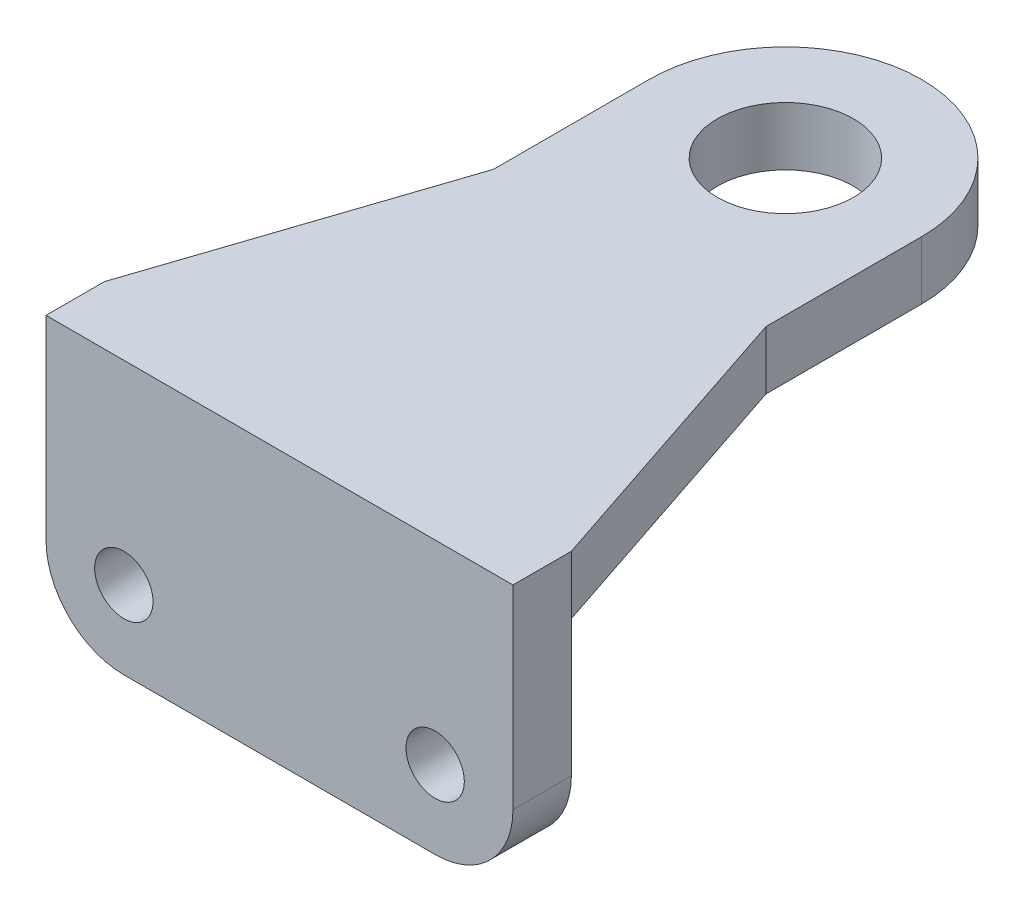
ISO-10303-21;
HEADER;
FILE_DESCRIPTION(('STEP AP214'),'2;1');
FILE_NAME('part.step','',(''),(''),'','','');
FILE_SCHEMA(('AUTOMOTIVE_DESIGN { 1 0 10303 214 1 1 1 1 }'));
ENDSEC;
DATA;
#1=APPLICATION_CONTEXT('core data for automotive mechanical design processes');
#2=APPLICATION_PROTOCOL_DEFINITION('international standard','automotive_design',2000,#1);
#3=PRODUCT_CONTEXT('',#1,'mechanical');
#4=PRODUCT('Part','Part','',(#3));
#5=PRODUCT_RELATED_PRODUCT_CATEGORY('part','',(#4));
#6=PRODUCT_DEFINITION_FORMATION('','',#4);
#7=PRODUCT_DEFINITION_CONTEXT('part definition',#1,'design');
#8=PRODUCT_DEFINITION('design','',#6,#7);
#9=PRODUCT_DEFINITION_SHAPE('','',#8);
#10=(LENGTH_UNIT() NAMED_UNIT(*) SI_UNIT(.MILLI.,.METRE.));
#11=(NAMED_UNIT(*) PLANE_ANGLE_UNIT() SI_UNIT($,.RADIAN.));
#12=(NAMED_UNIT(*) SI_UNIT($,.STERADIAN.) SOLID_ANGLE_UNIT());
#13=UNCERTAINTY_MEASURE_WITH_UNIT(LENGTH_MEASURE(1.E-05),#10,'distance_accuracy_value','');
#14=(GEOMETRIC_REPRESENTATION_CONTEXT(3) GLOBAL_UNCERTAINTY_ASSIGNED_CONTEXT((#13)) GLOBAL_UNIT_ASSIGNED_CONTEXT((#10,
#11,#12)) REPRESENTATION_CONTEXT('',''));
#15=CARTESIAN_POINT('',(0.,0.,0.));
#16=DIRECTION('',(0.,0.,1.));
#17=DIRECTION('',(1.,0.,0.));
#18=AXIS2_PLACEMENT_3D('',#15,#16,#17);
#19=CARTESIAN_POINT('',(-122.056451612903,10.1774193548387,15.));
#20=DIRECTION('',(0.,0.,1.));
#21=DIRECTION('',(1.,0.,0.));
#22=AXIS2_PLACEMENT_3D('',#19,#20,#21);
#23=PLANE('',#22);
#24=DIRECTION('',(1.,0.,0.));
#25=VECTOR('',#24,1.);
#26=CARTESIAN_POINT('',(-122.056451612903,-9.82258064516129,15.));
#27=LINE('',#26,#25);
#28=CARTESIAN_POINT('',(-122.056451612903,-9.82258064516129,15.));
#29=VERTEX_POINT('',#28);
#30=CARTESIAN_POINT('',(-42.0564516129034,-9.82258064516129,15.));
#31=VERTEX_POINT('',#30);
#32=EDGE_CURVE('E226',#29,#31,#27,.T.);
#33=ORIENTED_EDGE('',*,*,#32,.T.);
#34=CARTESIAN_POINT('',(-42.0564516129033,10.1774193548387,15.));
#35=DIRECTION('',(0.,0.,1.));
#36=DIRECTION('',(1.,0.,0.));
#37=AXIS2_PLACEMENT_3D('',#34,#35,#36);
#38=CIRCLE('',#37,20.);
#39=CARTESIAN_POINT('',(-22.0564516129033,10.1774193548388,15.));
#40=VERTEX_POINT('',#39);
#41=EDGE_CURVE('E223',#31,#40,#38,.T.);
#42=ORIENTED_EDGE('',*,*,#41,.T.);
#43=DIRECTION('',(0.,1.,0.));
#44=VECTOR('',#43,1.);
#45=CARTESIAN_POINT('',(-22.0564516129033,60.1774193548387,15.));
#46=LINE('',#45,#44);
#47=CARTESIAN_POINT('',(-22.0564516129033,60.1774193548387,15.));
#48=VERTEX_POINT('',#47);
#49=EDGE_CURVE('E220',#40,#48,#46,.T.);
#50=ORIENTED_EDGE('',*,*,#49,.T.);
#51=DIRECTION('',(-1.,0.,0.));
#52=VECTOR('',#51,1.);
#53=CARTESIAN_POINT('',(-142.056451612903,60.1774193548387,15.));
#54=LINE('',#53,#52);
#55=CARTESIAN_POINT('',(-142.056451612903,60.1774193548387,15.));
#56=VERTEX_POINT('',#55);
#57=EDGE_CURVE('E198',#48,#56,#54,.T.);
#58=ORIENTED_EDGE('',*,*,#57,.T.);
#59=DIRECTION('',(0.,-1.,0.));
#60=VECTOR('',#59,1.);
#61=CARTESIAN_POINT('',(-142.056451612903,60.1774193548387,15.));
#62=LINE('',#61,#60);
#63=CARTESIAN_POINT('',(-142.056451612903,10.1774193548388,15.));
#64=VERTEX_POINT('',#63);
#65=EDGE_CURVE('E203',#56,#64,#62,.T.);
#66=ORIENTED_EDGE('',*,*,#65,.T.);
#67=CARTESIAN_POINT('',(-122.056451612903,10.1774193548387,15.));
#68=DIRECTION('',(0.,0.,1.));
#69=DIRECTION('',(1.,0.,0.));
#70=AXIS2_PLACEMENT_3D('',#67,#68,#69);
#71=CIRCLE('',#70,20.);
#72=EDGE_CURVE('E229',#64,#29,#71,.T.);
#73=ORIENTED_EDGE('',*,*,#72,.T.);
#74=EDGE_LOOP('',(#33,#42,#50,#58,#66,#73));
#75=FACE_BOUND('',#74,.T.);
#76=CARTESIAN_POINT('',(-122.056451612903,10.1774193548387,15.));
#77=DIRECTION('',(0.,0.,1.));
#78=DIRECTION('',(1.,0.,0.));
#79=AXIS2_PLACEMENT_3D('',#76,#77,#78);
#80=CIRCLE('',#79,7.50000000000001);
#81=CARTESIAN_POINT('',(-114.556451612903,10.1774193548387,15.));
#82=VERTEX_POINT('',#81);
#83=EDGE_CURVE('E239',#82,#82,#80,.T.);
#84=ORIENTED_EDGE('',*,*,#83,.F.);
#85=EDGE_LOOP('',(#84));
#86=FACE_BOUND('',#85,.T.);
#87=CARTESIAN_POINT('',(-42.0564516129033,10.1774193548387,15.));
#88=DIRECTION('',(0.,0.,1.));
#89=DIRECTION('',(1.,0.,0.));
#90=AXIS2_PLACEMENT_3D('',#87,#88,#89);
#91=CIRCLE('',#90,7.5);
#92=CARTESIAN_POINT('',(-34.5564516129033,10.1774193548387,15.));
#93=VERTEX_POINT('',#92);
#94=EDGE_CURVE('E240',#93,#93,#91,.T.);
#95=ORIENTED_EDGE('',*,*,#94,.F.);
#96=EDGE_LOOP('',(#95));
#97=FACE_BOUND('',#96,.T.);
#98=ADVANCED_FACE('F45',(#75,#86,#97),#23,.T.);
#99=CARTESIAN_POINT('',(-122.056451612903,10.1774193548387,0.));
#100=DIRECTION('',(0.,0.,1.));
#101=DIRECTION('',(1.,0.,0.));
#102=AXIS2_PLACEMENT_3D('',#99,#100,#101);
#103=PLANE('',#102);
#104=DIRECTION('',(1.,0.,0.));
#105=VECTOR('',#104,1.);
#106=CARTESIAN_POINT('',(-142.056451612903,45.1774193548387,0.));
#107=LINE('',#106,#105);
#108=CARTESIAN_POINT('',(-142.056451612903,45.1774193548387,0.));
#109=VERTEX_POINT('',#108);
#110=CARTESIAN_POINT('',(-87.0564516129033,45.1774193548387,0.));
#111=VERTEX_POINT('',#110);
#112=EDGE_CURVE('E156',#109,#111,#107,.T.);
#113=ORIENTED_EDGE('',*,*,#112,.T.);
#114=DIRECTION('',(0.,-1.,0.));
#115=VECTOR('',#114,1.);
#116=CARTESIAN_POINT('',(-87.0564516129033,10.1774193548387,0.));
#117=LINE('',#116,#115);
#118=CARTESIAN_POINT('',(-87.0564516129033,-4.82258064516129,0.));
#119=VERTEX_POINT('',#118);
#120=EDGE_CURVE('E61',#111,#119,#117,.T.);
#121=ORIENTED_EDGE('',*,*,#120,.T.);
#122=DIRECTION('',(-1.,0.,0.));
#123=VECTOR('',#122,1.);
#124=CARTESIAN_POINT('',(-122.056451612903,-4.82258064516129,0.));
#125=LINE('',#124,#123);
#126=CARTESIAN_POINT('',(-77.0564516129033,-4.82258064516129,0.));
#127=VERTEX_POINT('',#126);
#128=EDGE_CURVE('E65',#119,#127,#125,.F.);
#129=ORIENTED_EDGE('',*,*,#128,.T.);
#130=DIRECTION('',(0.,-1.,0.));
#131=VECTOR('',#130,1.);
#132=CARTESIAN_POINT('',(-77.0564516129033,10.1774193548387,0.));
#133=LINE('',#132,#131);
#134=CARTESIAN_POINT('',(-77.0564516129033,45.1774193548387,0.));
#135=VERTEX_POINT('',#134);
#136=EDGE_CURVE('E159',#135,#127,#133,.T.);
#137=ORIENTED_EDGE('',*,*,#136,.F.);
#138=CARTESIAN_POINT('',(-22.0564516129033,45.1774193548387,0.));
#139=VERTEX_POINT('',#138);
#140=EDGE_CURVE('E145',#135,#139,#107,.T.);
#141=ORIENTED_EDGE('',*,*,#140,.T.);
#142=DIRECTION('',(0.,1.,0.));
#143=VECTOR('',#142,1.);
#144=CARTESIAN_POINT('',(-22.0564516129033,60.1774193548387,0.));
#145=LINE('',#144,#143);
#146=CARTESIAN_POINT('',(-22.0564516129033,10.1774193548388,0.));
#147=VERTEX_POINT('',#146);
#148=EDGE_CURVE('E199',#147,#139,#145,.T.);
#149=ORIENTED_EDGE('',*,*,#148,.F.);
#150=CARTESIAN_POINT('',(-42.0564516129033,10.1774193548387,0.));
#151=DIRECTION('',(0.,0.,1.));
#152=DIRECTION('',(1.,0.,0.));
#153=AXIS2_PLACEMENT_3D('',#150,#151,#152);
#154=CIRCLE('',#153,20.);
#155=CARTESIAN_POINT('',(-42.0564516129034,-9.82258064516129,0.));
#156=VERTEX_POINT('',#155);
#157=EDGE_CURVE('E204',#156,#147,#154,.T.);
#158=ORIENTED_EDGE('',*,*,#157,.F.);
#159=DIRECTION('',(1.,0.,0.));
#160=VECTOR('',#159,1.);
#161=CARTESIAN_POINT('',(-122.056451612903,-9.82258064516129,0.));
#162=LINE('',#161,#160);
#163=CARTESIAN_POINT('',(-122.056451612903,-9.82258064516129,0.));
#164=VERTEX_POINT('',#163);
#165=EDGE_CURVE('E207',#164,#156,#162,.T.);
#166=ORIENTED_EDGE('',*,*,#165,.F.);
#167=CARTESIAN_POINT('',(-122.056451612903,10.1774193548387,0.));
#168=DIRECTION('',(0.,0.,1.));
#169=DIRECTION('',(1.,0.,0.));
#170=AXIS2_PLACEMENT_3D('',#167,#168,#169);
#171=CIRCLE('',#170,20.);
#172=CARTESIAN_POINT('',(-142.056451612903,10.1774193548388,0.));
#173=VERTEX_POINT('',#172);
#174=EDGE_CURVE('E210',#173,#164,#171,.T.);
#175=ORIENTED_EDGE('',*,*,#174,.F.);
#176=DIRECTION('',(0.,-1.,0.));
#177=VECTOR('',#176,1.);
#178=CARTESIAN_POINT('',(-142.056451612903,60.1774193548387,0.));
#179=LINE('',#178,#177);
#180=EDGE_CURVE('E217',#109,#173,#179,.T.);
#181=ORIENTED_EDGE('',*,*,#180,.F.);
#182=EDGE_LOOP('',(#113,#121,#129,#137,#141,#149,#158,#166,#175,#181));
#183=FACE_BOUND('',#182,.T.);
#184=CARTESIAN_POINT('',(-122.056451612903,10.1774193548387,0.));
#185=DIRECTION('',(0.,0.,1.));
#186=DIRECTION('',(1.,0.,0.));
#187=AXIS2_PLACEMENT_3D('',#184,#185,#186);
#188=CIRCLE('',#187,7.50000000000001);
#189=CARTESIAN_POINT('',(-114.556451612903,10.1774193548387,0.));
#190=VERTEX_POINT('',#189);
#191=EDGE_CURVE('E235',#190,#190,#188,.T.);
#192=ORIENTED_EDGE('',*,*,#191,.T.);
#193=EDGE_LOOP('',(#192));
#194=FACE_BOUND('',#193,.T.);
#195=CARTESIAN_POINT('',(-42.0564516129033,10.1774193548387,0.));
#196=DIRECTION('',(0.,0.,1.));
#197=DIRECTION('',(1.,0.,0.));
#198=AXIS2_PLACEMENT_3D('',#195,#196,#197);
#199=CIRCLE('',#198,7.5);
#200=CARTESIAN_POINT('',(-34.5564516129033,10.1774193548387,0.));
#201=VERTEX_POINT('',#200);
#202=EDGE_CURVE('E244',#201,#201,#199,.T.);
#203=ORIENTED_EDGE('',*,*,#202,.T.);
#204=EDGE_LOOP('',(#203));
#205=FACE_BOUND('',#204,.T.);
#206=ADVANCED_FACE('F160',(#183,#194,#205),#103,.F.);
#207=CARTESIAN_POINT('',(-142.056451612903,60.1774193548387,15.));
#208=DIRECTION('',(1.,0.,0.));
#209=DIRECTION('',(0.,0.,-1.));
#210=AXIS2_PLACEMENT_3D('',#207,#208,#209);
#211=PLANE('',#210);
#212=CARTESIAN_POINT('',(-142.056451612903,60.1774193548387,0.));
#213=VERTEX_POINT('',#212);
#214=EDGE_CURVE('E213',#213,#109,#179,.T.);
#215=ORIENTED_EDGE('',*,*,#214,.T.);
#216=ORIENTED_EDGE('',*,*,#180,.T.);
#217=DIRECTION('',(0.,0.,-1.));
#218=VECTOR('',#217,1.);
#219=CARTESIAN_POINT('',(-142.056451612903,10.1774193548388,15.));
#220=LINE('',#219,#218);
#221=EDGE_CURVE('E171',#64,#173,#220,.T.);
#222=ORIENTED_EDGE('',*,*,#221,.F.);
#223=ORIENTED_EDGE('',*,*,#65,.F.);
#224=DIRECTION('',(0.,0.,-1.));
#225=VECTOR('',#224,1.);
#226=CARTESIAN_POINT('',(-142.056451612903,60.1774193548387,15.));
#227=LINE('',#226,#225);
#228=EDGE_CURVE('E194',#56,#213,#227,.T.);
#229=ORIENTED_EDGE('',*,*,#228,.T.);
#230=EDGE_LOOP('',(#215,#216,#222,#223,#229));
#231=FACE_BOUND('',#230,.T.);
#232=ADVANCED_FACE('F47',(#231),#211,.F.);
#233=CARTESIAN_POINT('',(-122.056451612903,10.1774193548387,15.));
#234=DIRECTION('',(0.,0.,-1.));
#235=DIRECTION('',(-1.,0.,0.));
#236=AXIS2_PLACEMENT_3D('',#233,#234,#235);
#237=CYLINDRICAL_SURFACE('',#236,20.);
#238=ORIENTED_EDGE('',*,*,#174,.T.);
#239=DIRECTION('',(0.,0.,-1.));
#240=VECTOR('',#239,1.);
#241=CARTESIAN_POINT('',(-122.056451612903,-9.82258064516129,15.));
#242=LINE('',#241,#240);
#243=EDGE_CURVE('E176',#29,#164,#242,.T.);
#244=ORIENTED_EDGE('',*,*,#243,.F.);
#245=ORIENTED_EDGE('',*,*,#72,.F.);
#246=ORIENTED_EDGE('',*,*,#221,.T.);
#247=EDGE_LOOP('',(#238,#244,#245,#246));
#248=FACE_BOUND('',#247,.T.);
#249=ADVANCED_FACE('F371',(#248),#237,.T.);
#250=CARTESIAN_POINT('',(-122.056451612903,-9.82258064516129,15.));
#251=DIRECTION('',(0.,1.,0.));
#252=DIRECTION('',(0.,0.,1.));
#253=AXIS2_PLACEMENT_3D('',#250,#251,#252);
#254=PLANE('',#253);
#255=DIRECTION('',(0.,0.,-1.));
#256=VECTOR('',#255,1.);
#257=CARTESIAN_POINT('',(-42.0564516129034,-9.82258064516129,15.));
#258=LINE('',#257,#256);
#259=EDGE_CURVE('E182',#31,#156,#258,.T.);
#260=ORIENTED_EDGE('',*,*,#259,.F.);
#261=ORIENTED_EDGE('',*,*,#32,.F.);
#262=ORIENTED_EDGE('',*,*,#243,.T.);
#263=ORIENTED_EDGE('',*,*,#165,.T.);
#264=EDGE_LOOP('',(#260,#261,#262,#263));
#265=FACE_BOUND('',#264,.T.);
#266=ADVANCED_FACE('F368',(#265),#254,.F.);
#267=CARTESIAN_POINT('',(-42.0564516129033,10.1774193548387,15.));
#268=DIRECTION('',(0.,0.,-1.));
#269=DIRECTION('',(-1.,0.,0.));
#270=AXIS2_PLACEMENT_3D('',#267,#268,#269);
#271=CYLINDRICAL_SURFACE('',#270,20.);
#272=ORIENTED_EDGE('',*,*,#157,.T.);
#273=DIRECTION('',(0.,0.,-1.));
#274=VECTOR('',#273,1.);
#275=CARTESIAN_POINT('',(-22.0564516129033,10.1774193548388,15.));
#276=LINE('',#275,#274);
#277=EDGE_CURVE('E186',#40,#147,#276,.T.);
#278=ORIENTED_EDGE('',*,*,#277,.F.);
#279=ORIENTED_EDGE('',*,*,#41,.F.);
#280=ORIENTED_EDGE('',*,*,#259,.T.);
#281=EDGE_LOOP('',(#272,#278,#279,#280));
#282=FACE_BOUND('',#281,.T.);
#283=ADVANCED_FACE('F363',(#282),#271,.T.);
#284=CARTESIAN_POINT('',(-22.0564516129033,60.1774193548387,15.));
#285=DIRECTION('',(-1.,0.,0.));
#286=DIRECTION('',(0.,0.,1.));
#287=AXIS2_PLACEMENT_3D('',#284,#285,#286);
#288=PLANE('',#287);
#289=ORIENTED_EDGE('',*,*,#148,.T.);
#290=DIRECTION('',(0.,1.,0.));
#291=VECTOR('',#290,1.);
#292=CARTESIAN_POINT('',(-22.0564516129033,45.1774193548387,0.));
#293=LINE('',#292,#291);
#294=CARTESIAN_POINT('',(-22.0564516129033,60.1774193548387,0.));
#295=VERTEX_POINT('',#294);
#296=EDGE_CURVE('E259',#139,#295,#293,.T.);
#297=ORIENTED_EDGE('',*,*,#296,.T.);
#298=DIRECTION('',(0.,0.,-1.));
#299=VECTOR('',#298,1.);
#300=CARTESIAN_POINT('',(-22.0564516129033,60.1774193548387,15.));
#301=LINE('',#300,#299);
#302=EDGE_CURVE('E190',#48,#295,#301,.T.);
#303=ORIENTED_EDGE('',*,*,#302,.F.);
#304=ORIENTED_EDGE('',*,*,#49,.F.);
#305=ORIENTED_EDGE('',*,*,#277,.T.);
#306=EDGE_LOOP('',(#289,#297,#303,#304,#305));
#307=FACE_BOUND('',#306,.T.);
#308=ADVANCED_FACE('F358',(#307),#288,.F.);
#309=CARTESIAN_POINT('',(-142.056451612903,60.1774193548387,15.));
#310=DIRECTION('',(0.,-1.,0.));
#311=DIRECTION('',(0.,0.,-1.));
#312=AXIS2_PLACEMENT_3D('',#309,#310,#311);
#313=PLANE('',#312);
#314=ORIENTED_EDGE('',*,*,#228,.F.);
#315=ORIENTED_EDGE('',*,*,#57,.F.);
#316=ORIENTED_EDGE('',*,*,#302,.T.);
#317=DIRECTION('',(-0.316227766016838,0.,-0.948683298050514));
#318=VECTOR('',#317,1.);
#319=CARTESIAN_POINT('',(-47.0564516129033,60.1774193548387,-75.));
#320=LINE('',#319,#318);
#321=CARTESIAN_POINT('',(-47.0564516129033,60.1774193548387,-75.));
#322=VERTEX_POINT('',#321);
#323=EDGE_CURVE('E273',#295,#322,#320,.T.);
#324=ORIENTED_EDGE('',*,*,#323,.T.);
#325=DIRECTION('',(0.,0.,-1.));
#326=VECTOR('',#325,1.);
#327=CARTESIAN_POINT('',(-47.0564516129033,60.1774193548387,-115.));
#328=LINE('',#327,#326);
#329=CARTESIAN_POINT('',(-47.0564516129033,60.1774193548387,-115.));
#330=VERTEX_POINT('',#329);
#331=EDGE_CURVE('E268',#322,#330,#328,.T.);
#332=ORIENTED_EDGE('',*,*,#331,.T.);
#333=CARTESIAN_POINT('',(-82.0564516129033,60.1774193548387,-115.));
#334=DIRECTION('',(0.,1.,0.));
#335=DIRECTION('',(0.,0.,1.));
#336=AXIS2_PLACEMENT_3D('',#333,#334,#335);
#337=CIRCLE('',#336,35.);
#338=CARTESIAN_POINT('',(-117.056451612903,60.1774193548387,-115.));
#339=VERTEX_POINT('',#338);
#340=EDGE_CURVE('E285',#330,#339,#337,.T.);
#341=ORIENTED_EDGE('',*,*,#340,.T.);
#342=DIRECTION('',(0.,0.,1.));
#343=VECTOR('',#342,1.);
#344=CARTESIAN_POINT('',(-117.056451612903,60.1774193548387,-115.));
#345=LINE('',#344,#343);
#346=CARTESIAN_POINT('',(-117.056451612903,60.1774193548387,-75.));
#347=VERTEX_POINT('',#346);
#348=EDGE_CURVE('E281',#339,#347,#345,.T.);
#349=ORIENTED_EDGE('',*,*,#348,.T.);
#350=DIRECTION('',(-0.316227766016838,0.,0.948683298050514));
#351=VECTOR('',#350,1.);
#352=CARTESIAN_POINT('',(-117.056451612903,60.1774193548387,-75.));
#353=LINE('',#352,#351);
#354=EDGE_CURVE('E277',#347,#213,#353,.T.);
#355=ORIENTED_EDGE('',*,*,#354,.T.);
#356=EDGE_LOOP('',(#314,#315,#316,#324,#332,#341,#349,#355));
#357=FACE_BOUND('',#356,.T.);
#358=CARTESIAN_POINT('',(-82.0564516129033,60.1774193548387,-115.));
#359=DIRECTION('',(0.,1.,0.));
#360=DIRECTION('',(0.,0.,1.));
#361=AXIS2_PLACEMENT_3D('',#358,#359,#360);
#362=CIRCLE('',#361,17.5);
#363=CARTESIAN_POINT('',(-82.0564516129033,60.1774193548387,-97.5));
#364=VERTEX_POINT('',#363);
#365=EDGE_CURVE('E306',#364,#364,#362,.T.);
#366=ORIENTED_EDGE('',*,*,#365,.F.);
#367=EDGE_LOOP('',(#366));
#368=FACE_BOUND('',#367,.T.);
#369=ADVANCED_FACE('F340',(#357,#368),#313,.F.);
#370=CARTESIAN_POINT('',(-122.056451612903,10.1774193548387,15.));
#371=DIRECTION('',(0.,0.,-1.));
#372=DIRECTION('',(-1.,0.,0.));
#373=AXIS2_PLACEMENT_3D('',#370,#371,#372);
#374=CYLINDRICAL_SURFACE('',#373,7.50000000000001);
#375=ORIENTED_EDGE('',*,*,#83,.T.);
#376=EDGE_LOOP('',(#375));
#377=FACE_BOUND('',#376,.T.);
#378=ORIENTED_EDGE('',*,*,#191,.F.);
#379=EDGE_LOOP('',(#378));
#380=FACE_BOUND('',#379,.T.);
#381=ADVANCED_FACE('F383',(#377,#380),#374,.F.);
#382=CARTESIAN_POINT('',(-42.0564516129033,10.1774193548387,15.));
#383=DIRECTION('',(0.,0.,-1.));
#384=DIRECTION('',(-1.,0.,0.));
#385=AXIS2_PLACEMENT_3D('',#382,#383,#384);
#386=CYLINDRICAL_SURFACE('',#385,7.5);
#387=ORIENTED_EDGE('',*,*,#94,.T.);
#388=EDGE_LOOP('',(#387));
#389=FACE_BOUND('',#388,.T.);
#390=ORIENTED_EDGE('',*,*,#202,.F.);
#391=EDGE_LOOP('',(#390));
#392=FACE_BOUND('',#391,.T.);
#393=ADVANCED_FACE('F380',(#389,#392),#386,.F.);
#394=CARTESIAN_POINT('',(-82.0564516129033,45.1774193548387,-115.));
#395=DIRECTION('',(0.,1.,0.));
#396=DIRECTION('',(0.,0.,1.));
#397=AXIS2_PLACEMENT_3D('',#394,#395,#396);
#398=CYLINDRICAL_SURFACE('',#397,35.);
#399=ORIENTED_EDGE('',*,*,#340,.F.);
#400=DIRECTION('',(0.,1.,0.));
#401=VECTOR('',#400,1.);
#402=CARTESIAN_POINT('',(-47.0564516129033,45.1774193548387,-115.));
#403=LINE('',#402,#401);
#404=CARTESIAN_POINT('',(-47.0564516129033,45.1774193548387,-115.));
#405=VERTEX_POINT('',#404);
#406=EDGE_CURVE('E248',#405,#330,#403,.T.);
#407=ORIENTED_EDGE('',*,*,#406,.F.);
#408=CARTESIAN_POINT('',(-82.0564516129033,45.1774193548387,-115.));
#409=DIRECTION('',(0.,1.,0.));
#410=DIRECTION('',(0.,0.,1.));
#411=AXIS2_PLACEMENT_3D('',#408,#409,#410);
#412=CIRCLE('',#411,35.);
#413=CARTESIAN_POINT('',(-117.056451612903,45.1774193548387,-115.));
#414=VERTEX_POINT('',#413);
#415=EDGE_CURVE('E272',#405,#414,#412,.T.);
#416=ORIENTED_EDGE('',*,*,#415,.T.);
#417=DIRECTION('',(0.,1.,0.));
#418=VECTOR('',#417,1.);
#419=CARTESIAN_POINT('',(-117.056451612903,45.1774193548387,-115.));
#420=LINE('',#419,#418);
#421=EDGE_CURVE('E252',#414,#339,#420,.T.);
#422=ORIENTED_EDGE('',*,*,#421,.T.);
#423=EDGE_LOOP('',(#399,#407,#416,#422));
#424=FACE_BOUND('',#423,.T.);
#425=ADVANCED_FACE('F350',(#424),#398,.T.);
#426=CARTESIAN_POINT('',(-47.0564516129033,45.1774193548387,-115.));
#427=DIRECTION('',(1.,0.,0.));
#428=DIRECTION('',(0.,0.,-1.));
#429=AXIS2_PLACEMENT_3D('',#426,#427,#428);
#430=PLANE('',#429);
#431=ORIENTED_EDGE('',*,*,#331,.F.);
#432=DIRECTION('',(0.,1.,0.));
#433=VECTOR('',#432,1.);
#434=CARTESIAN_POINT('',(-47.0564516129033,45.1774193548387,-75.));
#435=LINE('',#434,#433);
#436=CARTESIAN_POINT('',(-47.0564516129033,45.1774193548387,-75.));
#437=VERTEX_POINT('',#436);
#438=EDGE_CURVE('E263',#437,#322,#435,.T.);
#439=ORIENTED_EDGE('',*,*,#438,.F.);
#440=DIRECTION('',(0.,0.,-1.));
#441=VECTOR('',#440,1.);
#442=CARTESIAN_POINT('',(-47.0564516129033,45.1774193548387,-115.));
#443=LINE('',#442,#441);
#444=EDGE_CURVE('E256',#437,#405,#443,.T.);
#445=ORIENTED_EDGE('',*,*,#444,.T.);
#446=ORIENTED_EDGE('',*,*,#406,.T.);
#447=EDGE_LOOP('',(#431,#439,#445,#446));
#448=FACE_BOUND('',#447,.T.);
#449=ADVANCED_FACE('F353',(#448),#430,.T.);
#450=CARTESIAN_POINT('',(-47.0564516129033,45.1774193548387,-75.));
#451=DIRECTION('',(0.948683298050514,0.,-0.316227766016838));
#452=DIRECTION('',(-0.316227766016838,0.,-0.948683298050514));
#453=AXIS2_PLACEMENT_3D('',#450,#451,#452);
#454=PLANE('',#453);
#455=ORIENTED_EDGE('',*,*,#323,.F.);
#456=ORIENTED_EDGE('',*,*,#296,.F.);
#457=DIRECTION('',(-0.316227766016838,0.,-0.948683298050514));
#458=VECTOR('',#457,1.);
#459=CARTESIAN_POINT('',(-47.0564516129033,45.1774193548387,-75.));
#460=LINE('',#459,#458);
#461=EDGE_CURVE('E152',#139,#437,#460,.T.);
#462=ORIENTED_EDGE('',*,*,#461,.T.);
#463=ORIENTED_EDGE('',*,*,#438,.T.);
#464=EDGE_LOOP('',(#455,#456,#462,#463));
#465=FACE_BOUND('',#464,.T.);
#466=ADVANCED_FACE('F355',(#465),#454,.T.);
#467=CARTESIAN_POINT('',(-117.056451612903,45.1774193548387,-75.));
#468=DIRECTION('',(-0.948683298050514,0.,-0.316227766016838));
#469=DIRECTION('',(-0.316227766016838,0.,0.948683298050514));
#470=AXIS2_PLACEMENT_3D('',#467,#468,#469);
#471=PLANE('',#470);
#472=ORIENTED_EDGE('',*,*,#354,.F.);
#473=DIRECTION('',(0.,1.,0.));
#474=VECTOR('',#473,1.);
#475=CARTESIAN_POINT('',(-117.056451612903,45.1774193548387,-75.));
#476=LINE('',#475,#474);
#477=CARTESIAN_POINT('',(-117.056451612903,45.1774193548387,-75.));
#478=VERTEX_POINT('',#477);
#479=EDGE_CURVE('E255',#478,#347,#476,.T.);
#480=ORIENTED_EDGE('',*,*,#479,.F.);
#481=DIRECTION('',(-0.316227766016838,0.,0.948683298050514));
#482=VECTOR('',#481,1.);
#483=CARTESIAN_POINT('',(-117.056451612903,45.1774193548387,-75.));
#484=LINE('',#483,#482);
#485=EDGE_CURVE('E157',#478,#109,#484,.T.);
#486=ORIENTED_EDGE('',*,*,#485,.T.);
#487=ORIENTED_EDGE('',*,*,#214,.F.);
#488=EDGE_LOOP('',(#472,#480,#486,#487));
#489=FACE_BOUND('',#488,.T.);
#490=ADVANCED_FACE('F338',(#489),#471,.T.);
#491=CARTESIAN_POINT('',(-117.056451612903,45.1774193548387,-115.));
#492=DIRECTION('',(-1.,0.,0.));
#493=DIRECTION('',(0.,0.,1.));
#494=AXIS2_PLACEMENT_3D('',#491,#492,#493);
#495=PLANE('',#494);
#496=ORIENTED_EDGE('',*,*,#348,.F.);
#497=ORIENTED_EDGE('',*,*,#421,.F.);
#498=DIRECTION('',(0.,0.,1.));
#499=VECTOR('',#498,1.);
#500=CARTESIAN_POINT('',(-117.056451612903,45.1774193548387,-115.));
#501=LINE('',#500,#499);
#502=EDGE_CURVE('E299',#414,#478,#501,.T.);
#503=ORIENTED_EDGE('',*,*,#502,.T.);
#504=ORIENTED_EDGE('',*,*,#479,.T.);
#505=EDGE_LOOP('',(#496,#497,#503,#504));
#506=FACE_BOUND('',#505,.T.);
#507=ADVANCED_FACE('F346',(#506),#495,.T.);
#508=CARTESIAN_POINT('',(-82.0564516129033,45.1774193548387,-115.));
#509=DIRECTION('',(0.,1.,0.));
#510=DIRECTION('',(0.,0.,1.));
#511=AXIS2_PLACEMENT_3D('',#508,#509,#510);
#512=PLANE('',#511);
#513=CARTESIAN_POINT('',(-82.0564516129033,45.1774193548387,-115.));
#514=DIRECTION('',(0.,1.,0.));
#515=DIRECTION('',(0.,0.,1.));
#516=AXIS2_PLACEMENT_3D('',#513,#514,#515);
#517=CIRCLE('',#516,17.5);
#518=CARTESIAN_POINT('',(-82.0564516129033,45.1774193548387,-97.5));
#519=VERTEX_POINT('',#518);
#520=EDGE_CURVE('E289',#519,#519,#517,.T.);
#521=ORIENTED_EDGE('',*,*,#520,.T.);
#522=EDGE_LOOP('',(#521));
#523=FACE_BOUND('',#522,.T.);
#524=DIRECTION('',(1.,0.,0.));
#525=VECTOR('',#524,1.);
#526=CARTESIAN_POINT('',(-82.0564516129033,45.1774193548387,-50.));
#527=LINE('',#526,#525);
#528=CARTESIAN_POINT('',(-77.0564516129033,45.1774193548387,-50.));
#529=VERTEX_POINT('',#528);
#530=CARTESIAN_POINT('',(-87.0564516129033,45.1774193548387,-50.));
#531=VERTEX_POINT('',#530);
#532=EDGE_CURVE('E54',#529,#531,#527,.F.);
#533=ORIENTED_EDGE('',*,*,#532,.T.);
#534=DIRECTION('',(0.,0.,1.));
#535=VECTOR('',#534,1.);
#536=CARTESIAN_POINT('',(-87.0564516129033,45.1774193548387,-115.));
#537=LINE('',#536,#535);
#538=EDGE_CURVE('E11',#531,#111,#537,.T.);
#539=ORIENTED_EDGE('',*,*,#538,.T.);
#540=ORIENTED_EDGE('',*,*,#112,.F.);
#541=ORIENTED_EDGE('',*,*,#485,.F.);
#542=ORIENTED_EDGE('',*,*,#502,.F.);
#543=ORIENTED_EDGE('',*,*,#415,.F.);
#544=ORIENTED_EDGE('',*,*,#444,.F.);
#545=ORIENTED_EDGE('',*,*,#461,.F.);
#546=ORIENTED_EDGE('',*,*,#140,.F.);
#547=DIRECTION('',(0.,0.,1.));
#548=VECTOR('',#547,1.);
#549=CARTESIAN_POINT('',(-77.0564516129033,45.1774193548387,-115.));
#550=LINE('',#549,#548);
#551=EDGE_CURVE('E148',#529,#135,#550,.T.);
#552=ORIENTED_EDGE('',*,*,#551,.F.);
#553=EDGE_LOOP('',(#533,#539,#540,#541,#542,#543,#544,#545,#546,#552));
#554=FACE_BOUND('',#553,.T.);
#555=ADVANCED_FACE('F146',(#523,#554),#512,.F.);
#556=CARTESIAN_POINT('',(-82.0564516129033,45.1774193548387,-115.));
#557=DIRECTION('',(0.,1.,0.));
#558=DIRECTION('',(0.,0.,1.));
#559=AXIS2_PLACEMENT_3D('',#556,#557,#558);
#560=CYLINDRICAL_SURFACE('',#559,17.5);
#561=ORIENTED_EDGE('',*,*,#520,.F.);
#562=EDGE_LOOP('',(#561));
#563=FACE_BOUND('',#562,.T.);
#564=ORIENTED_EDGE('',*,*,#365,.T.);
#565=EDGE_LOOP('',(#564));
#566=FACE_BOUND('',#565,.T.);
#567=ADVANCED_FACE('F474',(#563,#566),#560,.F.);
#568=CARTESIAN_POINT('',(-82.0564516129033,-4.82258064516129,0.));
#569=DIRECTION('',(0.,0.707106781186548,0.707106781186548));
#570=DIRECTION('',(0.,0.707106781186547,-0.707106781186547));
#571=AXIS2_PLACEMENT_3D('',#568,#569,#570);
#572=PLANE('',#571);
#573=ORIENTED_EDGE('',*,*,#128,.F.);
#574=DIRECTION('',(0.,0.707106781186547,-0.707106781186547));
#575=VECTOR('',#574,1.);
#576=CARTESIAN_POINT('',(-87.0564516129033,-4.82258064516129,0.));
#577=LINE('',#576,#575);
#578=EDGE_CURVE('E166',#119,#531,#577,.T.);
#579=ORIENTED_EDGE('',*,*,#578,.T.);
#580=ORIENTED_EDGE('',*,*,#532,.F.);
#581=DIRECTION('',(0.,0.707106781186547,-0.707106781186547));
#582=VECTOR('',#581,1.);
#583=CARTESIAN_POINT('',(-77.0564516129033,-4.82258064516129,0.));
#584=LINE('',#583,#582);
#585=EDGE_CURVE('E169',#127,#529,#584,.T.);
#586=ORIENTED_EDGE('',*,*,#585,.F.);
#587=EDGE_LOOP('',(#573,#579,#580,#586));
#588=FACE_BOUND('',#587,.T.);
#589=ADVANCED_FACE('F323',(#588),#572,.F.);
#590=CARTESIAN_POINT('',(-87.0564516129033,25.1774193548387,-67.5));
#591=DIRECTION('',(-1.,0.,0.));
#592=DIRECTION('',(0.,0.,1.));
#593=AXIS2_PLACEMENT_3D('',#590,#591,#592);
#594=PLANE('',#593);
#595=ORIENTED_EDGE('',*,*,#120,.F.);
#596=ORIENTED_EDGE('',*,*,#538,.F.);
#597=ORIENTED_EDGE('',*,*,#578,.F.);
#598=EDGE_LOOP('',(#595,#596,#597));
#599=FACE_BOUND('',#598,.T.);
#600=ADVANCED_FACE('F326',(#599),#594,.T.);
#601=CARTESIAN_POINT('',(-77.0564516129033,25.1774193548387,-67.5));
#602=DIRECTION('',(-1.,0.,0.));
#603=DIRECTION('',(0.,0.,1.));
#604=AXIS2_PLACEMENT_3D('',#601,#602,#603);
#605=PLANE('',#604);
#606=ORIENTED_EDGE('',*,*,#551,.T.);
#607=ORIENTED_EDGE('',*,*,#136,.T.);
#608=ORIENTED_EDGE('',*,*,#585,.T.);
#609=EDGE_LOOP('',(#606,#607,#608));
#610=FACE_BOUND('',#609,.T.);
#611=ADVANCED_FACE('F168',(#610),#605,.F.);
#612=CLOSED_SHELL('',(#98,#206,#232,#249,#266,#283,#308,#369,#381,#393,#425,#449,#466,#490,#507,
#555,#567,#589,#600,#611));
#613=MANIFOLD_SOLID_BREP('B2',#612);
#614=ADVANCED_BREP_SHAPE_REPRESENTATION('',(#18,#613),#14);
#615=SHAPE_DEFINITION_REPRESENTATION(#9,#614);
ENDSEC;
END-ISO-10303-21;
